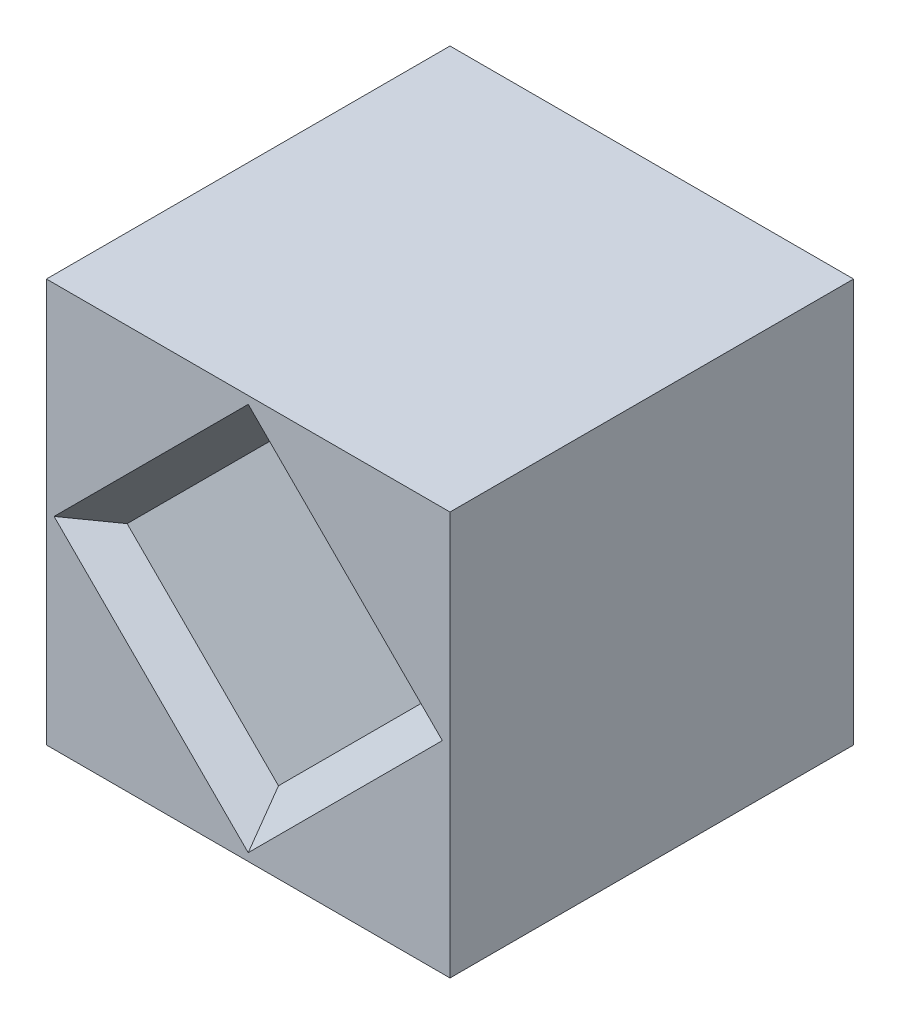
ISO-10303-21;
HEADER;
FILE_DESCRIPTION(('STEP AP214'),'2;1');
FILE_NAME('part.step','',(''),(''),'','','');
FILE_SCHEMA(('AUTOMOTIVE_DESIGN { 1 0 10303 214 1 1 1 1 }'));
ENDSEC;
DATA;
#1=APPLICATION_CONTEXT('core data for automotive mechanical design processes');
#2=APPLICATION_PROTOCOL_DEFINITION('international standard','automotive_design',2000,#1);
#3=PRODUCT_CONTEXT('',#1,'mechanical');
#4=PRODUCT('Part','Part','',(#3));
#5=PRODUCT_RELATED_PRODUCT_CATEGORY('part','',(#4));
#6=PRODUCT_DEFINITION_FORMATION('','',#4);
#7=PRODUCT_DEFINITION_CONTEXT('part definition',#1,'design');
#8=PRODUCT_DEFINITION('design','',#6,#7);
#9=PRODUCT_DEFINITION_SHAPE('','',#8);
#10=(LENGTH_UNIT() NAMED_UNIT(*) SI_UNIT(.MILLI.,.METRE.));
#11=(NAMED_UNIT(*) PLANE_ANGLE_UNIT() SI_UNIT($,.RADIAN.));
#12=(NAMED_UNIT(*) SI_UNIT($,.STERADIAN.) SOLID_ANGLE_UNIT());
#13=UNCERTAINTY_MEASURE_WITH_UNIT(LENGTH_MEASURE(1.E-05),#10,'distance_accuracy_value','');
#14=(GEOMETRIC_REPRESENTATION_CONTEXT(3) GLOBAL_UNCERTAINTY_ASSIGNED_CONTEXT((#13)) GLOBAL_UNIT_ASSIGNED_CONTEXT((#10,
#11,#12)) REPRESENTATION_CONTEXT('',''));
#15=CARTESIAN_POINT('',(0.,0.,0.));
#16=DIRECTION('',(0.,0.,1.));
#17=DIRECTION('',(1.,0.,0.));
#18=AXIS2_PLACEMENT_3D('',#15,#16,#17);
#19=CARTESIAN_POINT('',(0.,8.46666666666667,0.));
#20=DIRECTION('',(1.,0.,0.));
#21=DIRECTION('',(0.,0.,-1.));
#22=AXIS2_PLACEMENT_3D('',#19,#20,#21);
#23=PLANE('',#22);
#24=DIRECTION('',(0.,0.,1.));
#25=VECTOR('',#24,1.);
#26=CARTESIAN_POINT('',(0.,0.,0.));
#27=LINE('',#26,#25);
#28=CARTESIAN_POINT('',(0.,0.,-8.46666666666667));
#29=VERTEX_POINT('',#28);
#30=CARTESIAN_POINT('',(0.,0.,0.));
#31=VERTEX_POINT('',#30);
#32=EDGE_CURVE('E165',#29,#31,#27,.T.);
#33=ORIENTED_EDGE('',*,*,#32,.T.);
#34=DIRECTION('',(0.,-1.,0.));
#35=VECTOR('',#34,1.);
#36=CARTESIAN_POINT('',(0.,8.46666666666667,0.));
#37=LINE('',#36,#35);
#38=CARTESIAN_POINT('',(0.,8.46666666666667,0.));
#39=VERTEX_POINT('',#38);
#40=EDGE_CURVE('E144',#39,#31,#37,.T.);
#41=ORIENTED_EDGE('',*,*,#40,.F.);
#42=DIRECTION('',(0.,0.,1.));
#43=VECTOR('',#42,1.);
#44=CARTESIAN_POINT('',(0.,8.46666666666667,0.));
#45=LINE('',#44,#43);
#46=CARTESIAN_POINT('',(0.,8.46666666666667,-8.46666666666667));
#47=VERTEX_POINT('',#46);
#48=EDGE_CURVE('E152',#47,#39,#45,.T.);
#49=ORIENTED_EDGE('',*,*,#48,.F.);
#50=DIRECTION('',(0.,-1.,0.));
#51=VECTOR('',#50,1.);
#52=CARTESIAN_POINT('',(0.,8.46666666666667,-8.46666666666667));
#53=LINE('',#52,#51);
#54=EDGE_CURVE('E288',#47,#29,#53,.T.);
#55=ORIENTED_EDGE('',*,*,#54,.T.);
#56=EDGE_LOOP('',(#33,#41,#49,#55));
#57=FACE_BOUND('',#56,.T.);
#58=ADVANCED_FACE('F47',(#57),#23,.F.);
#59=CARTESIAN_POINT('',(0.,8.46666666666667,0.));
#60=DIRECTION('',(0.,0.,-1.));
#61=DIRECTION('',(-1.,0.,0.));
#62=AXIS2_PLACEMENT_3D('',#59,#60,#61);
#63=PLANE('',#62);
#64=DIRECTION('',(0.707106781186548,0.707106781186547,0.));
#65=VECTOR('',#64,1.);
#66=CARTESIAN_POINT('',(2.19682052727987,6.26984613938679,0.));
#67=LINE('',#66,#65);
#68=CARTESIAN_POINT('',(0.160307721226414,4.23333333333333,0.));
#69=VERTEX_POINT('',#68);
#70=CARTESIAN_POINT('',(4.23333333333333,8.30635894544025,0.));
#71=VERTEX_POINT('',#70);
#72=EDGE_CURVE('E212',#69,#71,#67,.T.);
#73=ORIENTED_EDGE('',*,*,#72,.T.);
#74=DIRECTION('',(0.707106781186548,-0.707106781186548,0.));
#75=VECTOR('',#74,1.);
#76=CARTESIAN_POINT('',(2.03651280605346,10.5031794727201,0.));
#77=LINE('',#76,#75);
#78=CARTESIAN_POINT('',(8.30635894544025,4.23333333333334,0.));
#79=VERTEX_POINT('',#78);
#80=EDGE_CURVE('E11',#71,#79,#77,.T.);
#81=ORIENTED_EDGE('',*,*,#80,.T.);
#82=DIRECTION('',(-0.707106781186547,-0.707106781186548,0.));
#83=VECTOR('',#82,1.);
#84=CARTESIAN_POINT('',(6.26984613938679,2.19682052727988,0.));
#85=LINE('',#84,#83);
#86=CARTESIAN_POINT('',(4.23333333333333,0.160307721226415,0.));
#87=VERTEX_POINT('',#86);
#88=EDGE_CURVE('E58',#79,#87,#85,.T.);
#89=ORIENTED_EDGE('',*,*,#88,.T.);
#90=DIRECTION('',(-0.707106781186548,0.707106781186547,0.));
#91=VECTOR('',#90,1.);
#92=CARTESIAN_POINT('',(-2.03651280605346,6.43015386061321,0.));
#93=LINE('',#92,#91);
#94=EDGE_CURVE('E215',#87,#69,#93,.T.);
#95=ORIENTED_EDGE('',*,*,#94,.T.);
#96=EDGE_LOOP('',(#73,#81,#89,#95));
#97=FACE_BOUND('',#96,.T.);
#98=DIRECTION('',(1.,0.,0.));
#99=VECTOR('',#98,1.);
#100=CARTESIAN_POINT('',(0.,0.,0.));
#101=LINE('',#100,#99);
#102=CARTESIAN_POINT('',(8.46666666666667,0.,0.));
#103=VERTEX_POINT('',#102);
#104=EDGE_CURVE('E275',#31,#103,#101,.T.);
#105=ORIENTED_EDGE('',*,*,#104,.T.);
#106=DIRECTION('',(0.,-1.,0.));
#107=VECTOR('',#106,1.);
#108=CARTESIAN_POINT('',(8.46666666666667,8.46666666666667,0.));
#109=LINE('',#108,#107);
#110=CARTESIAN_POINT('',(8.46666666666667,8.46666666666667,0.));
#111=VERTEX_POINT('',#110);
#112=EDGE_CURVE('E147',#111,#103,#109,.T.);
#113=ORIENTED_EDGE('',*,*,#112,.F.);
#114=DIRECTION('',(1.,0.,0.));
#115=VECTOR('',#114,1.);
#116=CARTESIAN_POINT('',(0.,8.46666666666667,0.));
#117=LINE('',#116,#115);
#118=EDGE_CURVE('E140',#39,#111,#117,.T.);
#119=ORIENTED_EDGE('',*,*,#118,.F.);
#120=ORIENTED_EDGE('',*,*,#40,.T.);
#121=EDGE_LOOP('',(#105,#113,#119,#120));
#122=FACE_BOUND('',#121,.T.);
#123=ADVANCED_FACE('F142',(#97,#122),#63,.F.);
#124=CARTESIAN_POINT('',(8.46666666666667,8.46666666666667,0.));
#125=DIRECTION('',(-1.,0.,0.));
#126=DIRECTION('',(0.,0.,1.));
#127=AXIS2_PLACEMENT_3D('',#124,#125,#126);
#128=PLANE('',#127);
#129=DIRECTION('',(0.,0.,-1.));
#130=VECTOR('',#129,1.);
#131=CARTESIAN_POINT('',(8.46666666666667,0.,0.));
#132=LINE('',#131,#130);
#133=CARTESIAN_POINT('',(8.46666666666667,0.,-8.46666666666667));
#134=VERTEX_POINT('',#133);
#135=EDGE_CURVE('E292',#103,#134,#132,.T.);
#136=ORIENTED_EDGE('',*,*,#135,.T.);
#137=DIRECTION('',(0.,-1.,0.));
#138=VECTOR('',#137,1.);
#139=CARTESIAN_POINT('',(8.46666666666667,8.46666666666667,-8.46666666666667));
#140=LINE('',#139,#138);
#141=CARTESIAN_POINT('',(8.46666666666667,8.46666666666667,-8.46666666666667));
#142=VERTEX_POINT('',#141);
#143=EDGE_CURVE('E173',#142,#134,#140,.T.);
#144=ORIENTED_EDGE('',*,*,#143,.F.);
#145=DIRECTION('',(0.,0.,-1.));
#146=VECTOR('',#145,1.);
#147=CARTESIAN_POINT('',(8.46666666666667,8.46666666666667,0.));
#148=LINE('',#147,#146);
#149=EDGE_CURVE('E151',#111,#142,#148,.T.);
#150=ORIENTED_EDGE('',*,*,#149,.F.);
#151=ORIENTED_EDGE('',*,*,#112,.T.);
#152=EDGE_LOOP('',(#136,#144,#150,#151));
#153=FACE_BOUND('',#152,.T.);
#154=ADVANCED_FACE('F308',(#153),#128,.F.);
#155=CARTESIAN_POINT('',(0.,8.46666666666667,-8.46666666666667));
#156=DIRECTION('',(0.,0.,1.));
#157=DIRECTION('',(1.,0.,0.));
#158=AXIS2_PLACEMENT_3D('',#155,#156,#157);
#159=PLANE('',#158);
#160=DIRECTION('',(-1.,0.,0.));
#161=VECTOR('',#160,1.);
#162=CARTESIAN_POINT('',(0.,0.,-8.46666666666667));
#163=LINE('',#162,#161);
#164=EDGE_CURVE('E162',#134,#29,#163,.T.);
#165=ORIENTED_EDGE('',*,*,#164,.T.);
#166=ORIENTED_EDGE('',*,*,#54,.F.);
#167=DIRECTION('',(-1.,0.,0.));
#168=VECTOR('',#167,1.);
#169=CARTESIAN_POINT('',(0.,8.46666666666667,-8.46666666666667));
#170=LINE('',#169,#168);
#171=EDGE_CURVE('E157',#142,#47,#170,.T.);
#172=ORIENTED_EDGE('',*,*,#171,.F.);
#173=ORIENTED_EDGE('',*,*,#143,.T.);
#174=EDGE_LOOP('',(#165,#166,#172,#173));
#175=FACE_BOUND('',#174,.T.);
#176=ADVANCED_FACE('F303',(#175),#159,.F.);
#177=CARTESIAN_POINT('',(0.,8.46666666666667,0.));
#178=DIRECTION('',(0.,-1.,0.));
#179=DIRECTION('',(0.,0.,-1.));
#180=AXIS2_PLACEMENT_3D('',#177,#178,#179);
#181=PLANE('',#180);
#182=ORIENTED_EDGE('',*,*,#48,.T.);
#183=ORIENTED_EDGE('',*,*,#118,.T.);
#184=ORIENTED_EDGE('',*,*,#149,.T.);
#185=ORIENTED_EDGE('',*,*,#171,.T.);
#186=EDGE_LOOP('',(#182,#183,#184,#185));
#187=FACE_BOUND('',#186,.T.);
#188=ADVANCED_FACE('F155',(#187),#181,.F.);
#189=CARTESIAN_POINT('',(0.,0.,0.));
#190=DIRECTION('',(0.,-1.,0.));
#191=DIRECTION('',(0.,0.,-1.));
#192=AXIS2_PLACEMENT_3D('',#189,#190,#191);
#193=PLANE('',#192);
#194=ORIENTED_EDGE('',*,*,#32,.F.);
#195=ORIENTED_EDGE('',*,*,#164,.F.);
#196=ORIENTED_EDGE('',*,*,#135,.F.);
#197=ORIENTED_EDGE('',*,*,#104,.F.);
#198=EDGE_LOOP('',(#194,#195,#196,#197));
#199=FACE_BOUND('',#198,.T.);
#200=ADVANCED_FACE('F307',(#199),#193,.T.);
#201=CARTESIAN_POINT('',(1.05833333333333,4.23333333333333,-6.35));
#202=DIRECTION('',(-0.707106781186547,0.707106781186548,0.));
#203=DIRECTION('',(-0.707106781186548,-0.707106781186547,0.));
#204=AXIS2_PLACEMENT_3D('',#201,#202,#203);
#205=PLANE('',#204);
#206=DIRECTION('',(0.,0.,1.));
#207=VECTOR('',#206,1.);
#208=CARTESIAN_POINT('',(1.05833333333333,4.23333333333333,-6.35));
#209=LINE('',#208,#207);
#210=CARTESIAN_POINT('',(1.05833333333333,4.23333333333333,-5.715));
#211=VERTEX_POINT('',#210);
#212=CARTESIAN_POINT('',(1.05833333333333,4.23333333333333,-0.634999999999998));
#213=VERTEX_POINT('',#212);
#214=EDGE_CURVE('E234',#211,#213,#209,.T.);
#215=ORIENTED_EDGE('',*,*,#214,.F.);
#216=DIRECTION('',(0.707106781186548,0.707106781186547,0.));
#217=VECTOR('',#216,1.);
#218=CARTESIAN_POINT('',(4.23333333333333,7.40833333333333,-5.715));
#219=LINE('',#218,#217);
#220=CARTESIAN_POINT('',(4.23333333333333,7.40833333333333,-5.715));
#221=VERTEX_POINT('',#220);
#222=EDGE_CURVE('E209',#211,#221,#219,.T.);
#223=ORIENTED_EDGE('',*,*,#222,.T.);
#224=DIRECTION('',(0.,0.,1.));
#225=VECTOR('',#224,1.);
#226=CARTESIAN_POINT('',(4.23333333333333,7.40833333333333,-6.35));
#227=LINE('',#226,#225);
#228=CARTESIAN_POINT('',(4.23333333333333,7.40833333333333,-0.634999999999998));
#229=VERTEX_POINT('',#228);
#230=EDGE_CURVE('E265',#221,#229,#227,.T.);
#231=ORIENTED_EDGE('',*,*,#230,.T.);
#232=DIRECTION('',(-0.707106781186548,-0.707106781186547,0.));
#233=VECTOR('',#232,1.);
#234=CARTESIAN_POINT('',(1.05833333333333,4.23333333333333,-0.634999999999998));
#235=LINE('',#234,#233);
#236=EDGE_CURVE('E206',#229,#213,#235,.T.);
#237=ORIENTED_EDGE('',*,*,#236,.T.);
#238=EDGE_LOOP('',(#215,#223,#231,#237));
#239=FACE_BOUND('',#238,.T.);
#240=ADVANCED_FACE('F269',(#239),#205,.F.);
#241=CARTESIAN_POINT('',(4.23333333333333,7.40833333333333,-6.35));
#242=DIRECTION('',(0.707106781186548,0.707106781186548,0.));
#243=DIRECTION('',(-0.707106781186548,0.707106781186548,0.));
#244=AXIS2_PLACEMENT_3D('',#241,#242,#243);
#245=PLANE('',#244);
#246=ORIENTED_EDGE('',*,*,#230,.F.);
#247=DIRECTION('',(0.707106781186548,-0.707106781186548,0.));
#248=VECTOR('',#247,1.);
#249=CARTESIAN_POINT('',(7.40833333333333,4.23333333333333,-5.715));
#250=LINE('',#249,#248);
#251=CARTESIAN_POINT('',(7.40833333333333,4.23333333333333,-5.715));
#252=VERTEX_POINT('',#251);
#253=EDGE_CURVE('E190',#221,#252,#250,.T.);
#254=ORIENTED_EDGE('',*,*,#253,.T.);
#255=DIRECTION('',(0.,0.,1.));
#256=VECTOR('',#255,1.);
#257=CARTESIAN_POINT('',(7.40833333333333,4.23333333333333,-6.35));
#258=LINE('',#257,#256);
#259=CARTESIAN_POINT('',(7.40833333333333,4.23333333333333,-0.634999999999998));
#260=VERTEX_POINT('',#259);
#261=EDGE_CURVE('E268',#252,#260,#258,.T.);
#262=ORIENTED_EDGE('',*,*,#261,.T.);
#263=DIRECTION('',(-0.707106781186548,0.707106781186548,0.));
#264=VECTOR('',#263,1.);
#265=CARTESIAN_POINT('',(4.23333333333333,7.40833333333333,-0.634999999999998));
#266=LINE('',#265,#264);
#267=EDGE_CURVE('E186',#260,#229,#266,.T.);
#268=ORIENTED_EDGE('',*,*,#267,.T.);
#269=EDGE_LOOP('',(#246,#254,#262,#268));
#270=FACE_BOUND('',#269,.T.);
#271=ADVANCED_FACE('F264',(#270),#245,.F.);
#272=CARTESIAN_POINT('',(4.23333333333333,1.05833333333333,-6.35));
#273=DIRECTION('',(0.707106781186548,-0.707106781186547,0.));
#274=DIRECTION('',(0.707106781186547,0.707106781186548,0.));
#275=AXIS2_PLACEMENT_3D('',#272,#273,#274);
#276=PLANE('',#275);
#277=ORIENTED_EDGE('',*,*,#261,.F.);
#278=DIRECTION('',(-0.707106781186547,-0.707106781186548,0.));
#279=VECTOR('',#278,1.);
#280=CARTESIAN_POINT('',(4.23333333333333,1.05833333333333,-5.715));
#281=LINE('',#280,#279);
#282=CARTESIAN_POINT('',(4.23333333333333,1.05833333333333,-5.715));
#283=VERTEX_POINT('',#282);
#284=EDGE_CURVE('E197',#252,#283,#281,.T.);
#285=ORIENTED_EDGE('',*,*,#284,.T.);
#286=DIRECTION('',(0.,0.,1.));
#287=VECTOR('',#286,1.);
#288=CARTESIAN_POINT('',(4.23333333333333,1.05833333333333,-6.35));
#289=LINE('',#288,#287);
#290=CARTESIAN_POINT('',(4.23333333333333,1.05833333333333,-0.634999999999998));
#291=VERTEX_POINT('',#290);
#292=EDGE_CURVE('E277',#283,#291,#289,.T.);
#293=ORIENTED_EDGE('',*,*,#292,.T.);
#294=DIRECTION('',(0.707106781186547,0.707106781186548,0.));
#295=VECTOR('',#294,1.);
#296=CARTESIAN_POINT('',(4.23333333333333,1.05833333333333,-0.634999999999998));
#297=LINE('',#296,#295);
#298=EDGE_CURVE('E194',#291,#260,#297,.T.);
#299=ORIENTED_EDGE('',*,*,#298,.T.);
#300=EDGE_LOOP('',(#277,#285,#293,#299));
#301=FACE_BOUND('',#300,.T.);
#302=ADVANCED_FACE('F405',(#301),#276,.F.);
#303=CARTESIAN_POINT('',(1.05833333333333,4.23333333333333,-6.35));
#304=DIRECTION('',(-0.707106781186547,-0.707106781186548,0.));
#305=DIRECTION('',(0.707106781186548,-0.707106781186547,0.));
#306=AXIS2_PLACEMENT_3D('',#303,#304,#305);
#307=PLANE('',#306);
#308=ORIENTED_EDGE('',*,*,#292,.F.);
#309=DIRECTION('',(-0.707106781186548,0.707106781186547,0.));
#310=VECTOR('',#309,1.);
#311=CARTESIAN_POINT('',(1.05833333333333,4.23333333333333,-5.715));
#312=LINE('',#311,#310);
#313=EDGE_CURVE('E203',#283,#211,#312,.T.);
#314=ORIENTED_EDGE('',*,*,#313,.T.);
#315=ORIENTED_EDGE('',*,*,#214,.T.);
#316=DIRECTION('',(0.707106781186548,-0.707106781186547,0.));
#317=VECTOR('',#316,1.);
#318=CARTESIAN_POINT('',(1.05833333333333,4.23333333333333,-0.634999999999998));
#319=LINE('',#318,#317);
#320=EDGE_CURVE('E200',#213,#291,#319,.T.);
#321=ORIENTED_EDGE('',*,*,#320,.T.);
#322=EDGE_LOOP('',(#308,#314,#315,#321));
#323=FACE_BOUND('',#322,.T.);
#324=ADVANCED_FACE('F396',(#323),#307,.F.);
#325=CARTESIAN_POINT('',(0.,0.,-6.35));
#326=DIRECTION('',(0.,0.,-1.));
#327=DIRECTION('',(-1.,0.,0.));
#328=AXIS2_PLACEMENT_3D('',#325,#326,#327);
#329=PLANE('',#328);
#330=DIRECTION('',(0.707106781186547,0.707106781186548,0.));
#331=VECTOR('',#330,1.);
#332=CARTESIAN_POINT('',(6.95932052727987,4.68234613938679,-6.35));
#333=LINE('',#332,#331);
#334=CARTESIAN_POINT('',(4.23333333333333,1.95635894544025,-6.35));
#335=VERTEX_POINT('',#334);
#336=CARTESIAN_POINT('',(6.51030772122641,4.23333333333333,-6.35));
#337=VERTEX_POINT('',#336);
#338=EDGE_CURVE('E179',#335,#337,#333,.T.);
#339=ORIENTED_EDGE('',*,*,#338,.T.);
#340=DIRECTION('',(-0.707106781186548,0.707106781186548,0.));
#341=VECTOR('',#340,1.);
#342=CARTESIAN_POINT('',(3.78432052727987,6.95932052727987,-6.35));
#343=LINE('',#342,#341);
#344=CARTESIAN_POINT('',(4.23333333333333,6.51030772122641,-6.35));
#345=VERTEX_POINT('',#344);
#346=EDGE_CURVE('E182',#337,#345,#343,.T.);
#347=ORIENTED_EDGE('',*,*,#346,.T.);
#348=DIRECTION('',(-0.707106781186548,-0.707106781186547,0.));
#349=VECTOR('',#348,1.);
#350=CARTESIAN_POINT('',(1.50734613938679,3.78432052727987,-6.35));
#351=LINE('',#350,#349);
#352=CARTESIAN_POINT('',(1.95635894544025,4.23333333333333,-6.35));
#353=VERTEX_POINT('',#352);
#354=EDGE_CURVE('E167',#345,#353,#351,.T.);
#355=ORIENTED_EDGE('',*,*,#354,.T.);
#356=DIRECTION('',(0.707106781186548,-0.707106781186547,0.));
#357=VECTOR('',#356,1.);
#358=CARTESIAN_POINT('',(4.68234613938679,1.50734613938679,-6.35));
#359=LINE('',#358,#357);
#360=EDGE_CURVE('E171',#353,#335,#359,.T.);
#361=ORIENTED_EDGE('',*,*,#360,.T.);
#362=EDGE_LOOP('',(#339,#347,#355,#361));
#363=FACE_BOUND('',#362,.T.);
#364=ADVANCED_FACE('F349',(#363),#329,.F.);
#365=CARTESIAN_POINT('',(3.09484613938679,3.09484613938679,-6.35));
#366=DIRECTION('',(0.499999999999997,0.499999999999997,0.707106781186552));
#367=DIRECTION('',(-0.707106781186548,0.707106781186547,0.));
#368=AXIS2_PLACEMENT_3D('',#365,#366,#367);
#369=PLANE('',#368);
#370=DIRECTION('',(0.816496580927729,0.,-0.577350269189621));
#371=VECTOR('',#370,1.);
#372=CARTESIAN_POINT('',(2.71535040807129,4.23333333333333,-6.88668801008909));
#373=LINE('',#372,#371);
#374=EDGE_CURVE('E226',#211,#353,#373,.T.);
#375=ORIENTED_EDGE('',*,*,#374,.F.);
#376=ORIENTED_EDGE('',*,*,#313,.F.);
#377=DIRECTION('',(0.,0.816496580927729,-0.577350269189621));
#378=VECTOR('',#377,1.);
#379=CARTESIAN_POINT('',(4.23333333333333,-0.106871814150958,-4.8910755387404));
#380=LINE('',#379,#378);
#381=EDGE_CURVE('E230',#335,#283,#380,.F.);
#382=ORIENTED_EDGE('',*,*,#381,.F.);
#383=ORIENTED_EDGE('',*,*,#360,.F.);
#384=EDGE_LOOP('',(#375,#376,#382,#383));
#385=FACE_BOUND('',#384,.T.);
#386=ADVANCED_FACE('F343',(#385),#369,.T.);
#387=CARTESIAN_POINT('',(1.13848719394654,-1.13848719394654,-6.35));
#388=DIRECTION('',(-0.499999999999997,0.499999999999997,0.707106781186552));
#389=DIRECTION('',(-0.707106781186547,-0.707106781186548,0.));
#390=AXIS2_PLACEMENT_3D('',#387,#388,#389);
#391=PLANE('',#390);
#392=ORIENTED_EDGE('',*,*,#381,.T.);
#393=ORIENTED_EDGE('',*,*,#284,.F.);
#394=DIRECTION('',(-0.81649658092773,0.,-0.577350269189621));
#395=VECTOR('',#394,1.);
#396=CARTESIAN_POINT('',(5.75131625859538,4.23333333333333,-6.88668801008909));
#397=LINE('',#396,#395);
#398=EDGE_CURVE('E223',#337,#252,#397,.F.);
#399=ORIENTED_EDGE('',*,*,#398,.F.);
#400=ORIENTED_EDGE('',*,*,#338,.F.);
#401=EDGE_LOOP('',(#392,#393,#399,#400));
#402=FACE_BOUND('',#401,.T.);
#403=ADVANCED_FACE('F336',(#402),#391,.T.);
#404=CARTESIAN_POINT('',(-1.13848719394654,1.13848719394654,-6.35));
#405=DIRECTION('',(0.499999999999997,-0.499999999999997,0.707106781186552));
#406=DIRECTION('',(0.707106781186548,0.707106781186547,0.));
#407=AXIS2_PLACEMENT_3D('',#404,#405,#406);
#408=PLANE('',#407);
#409=ORIENTED_EDGE('',*,*,#374,.T.);
#410=ORIENTED_EDGE('',*,*,#354,.F.);
#411=DIRECTION('',(0.,0.81649658092773,0.57735026918962));
#412=VECTOR('',#411,1.);
#413=CARTESIAN_POINT('',(4.23333333333333,5.75131625859538,-6.88668801008909));
#414=LINE('',#413,#412);
#415=EDGE_CURVE('E220',#221,#345,#414,.F.);
#416=ORIENTED_EDGE('',*,*,#415,.F.);
#417=ORIENTED_EDGE('',*,*,#222,.F.);
#418=EDGE_LOOP('',(#409,#410,#416,#417));
#419=FACE_BOUND('',#418,.T.);
#420=ADVANCED_FACE('F329',(#419),#408,.T.);
#421=CARTESIAN_POINT('',(5.37182052727987,5.37182052727987,-6.35));
#422=DIRECTION('',(-0.499999999999996,-0.499999999999996,0.707106781186553));
#423=DIRECTION('',(0.707106781186548,-0.707106781186548,0.));
#424=AXIS2_PLACEMENT_3D('',#421,#422,#423);
#425=PLANE('',#424);
#426=ORIENTED_EDGE('',*,*,#398,.T.);
#427=ORIENTED_EDGE('',*,*,#253,.F.);
#428=ORIENTED_EDGE('',*,*,#415,.T.);
#429=ORIENTED_EDGE('',*,*,#346,.F.);
#430=EDGE_LOOP('',(#426,#427,#428,#429));
#431=FACE_BOUND('',#430,.T.);
#432=ADVANCED_FACE('F323',(#431),#425,.T.);
#433=CARTESIAN_POINT('',(1.05833333333333,4.23333333333333,-0.634999999999998));
#434=DIRECTION('',(-0.499999999999999,-0.499999999999999,-0.707106781186549));
#435=DIRECTION('',(0.707106781186548,-0.707106781186547,0.));
#436=AXIS2_PLACEMENT_3D('',#433,#434,#435);
#437=PLANE('',#436);
#438=DIRECTION('',(0.816496580927727,0.,-0.577350269189624));
#439=VECTOR('',#438,1.);
#440=CARTESIAN_POINT('',(1.05833333333333,4.23333333333333,-0.634999999999998));
#441=LINE('',#440,#439);
#442=EDGE_CURVE('E239',#69,#213,#441,.T.);
#443=ORIENTED_EDGE('',*,*,#442,.F.);
#444=ORIENTED_EDGE('',*,*,#94,.F.);
#445=DIRECTION('',(0.,0.816496580927727,-0.577350269189624));
#446=VECTOR('',#445,1.);
#447=CARTESIAN_POINT('',(4.23333333333333,1.05833333333333,-0.634999999999998));
#448=LINE('',#447,#446);
#449=EDGE_CURVE('E52',#291,#87,#448,.F.);
#450=ORIENTED_EDGE('',*,*,#449,.F.);
#451=ORIENTED_EDGE('',*,*,#320,.F.);
#452=EDGE_LOOP('',(#443,#444,#450,#451));
#453=FACE_BOUND('',#452,.T.);
#454=ADVANCED_FACE('F50',(#453),#437,.F.);
#455=CARTESIAN_POINT('',(4.23333333333333,1.05833333333333,-0.634999999999998));
#456=DIRECTION('',(0.499999999999999,-0.499999999999999,-0.707106781186549));
#457=DIRECTION('',(0.707106781186547,0.707106781186548,0.));
#458=AXIS2_PLACEMENT_3D('',#455,#456,#457);
#459=PLANE('',#458);
#460=ORIENTED_EDGE('',*,*,#449,.T.);
#461=ORIENTED_EDGE('',*,*,#88,.F.);
#462=DIRECTION('',(-0.816496580927727,0.,-0.577350269189624));
#463=VECTOR('',#462,1.);
#464=CARTESIAN_POINT('',(5.29166666666666,4.23333333333333,-2.13170935351152));
#465=LINE('',#464,#463);
#466=EDGE_CURVE('E66',#260,#79,#465,.F.);
#467=ORIENTED_EDGE('',*,*,#466,.F.);
#468=ORIENTED_EDGE('',*,*,#298,.F.);
#469=EDGE_LOOP('',(#460,#461,#467,#468));
#470=FACE_BOUND('',#469,.T.);
#471=ADVANCED_FACE('F251',(#470),#459,.F.);
#472=CARTESIAN_POINT('',(1.05833333333333,4.23333333333333,-0.634999999999998));
#473=DIRECTION('',(-0.499999999999999,0.499999999999999,-0.707106781186549));
#474=DIRECTION('',(-0.707106781186548,-0.707106781186547,0.));
#475=AXIS2_PLACEMENT_3D('',#472,#473,#474);
#476=PLANE('',#475);
#477=ORIENTED_EDGE('',*,*,#442,.T.);
#478=ORIENTED_EDGE('',*,*,#236,.F.);
#479=DIRECTION('',(0.,0.816496580927728,0.577350269189624));
#480=VECTOR('',#479,1.);
#481=CARTESIAN_POINT('',(4.23333333333333,7.40833333333333,-0.634999999999998));
#482=LINE('',#481,#480);
#483=EDGE_CURVE('E235',#71,#229,#482,.F.);
#484=ORIENTED_EDGE('',*,*,#483,.F.);
#485=ORIENTED_EDGE('',*,*,#72,.F.);
#486=EDGE_LOOP('',(#477,#478,#484,#485));
#487=FACE_BOUND('',#486,.T.);
#488=ADVANCED_FACE('F256',(#487),#476,.F.);
#489=CARTESIAN_POINT('',(4.23333333333333,7.40833333333333,-0.634999999999998));
#490=DIRECTION('',(0.499999999999998,0.499999999999998,-0.70710678118655));
#491=DIRECTION('',(-0.707106781186548,0.707106781186548,0.));
#492=AXIS2_PLACEMENT_3D('',#489,#490,#491);
#493=PLANE('',#492);
#494=ORIENTED_EDGE('',*,*,#466,.T.);
#495=ORIENTED_EDGE('',*,*,#80,.F.);
#496=ORIENTED_EDGE('',*,*,#483,.T.);
#497=ORIENTED_EDGE('',*,*,#267,.F.);
#498=EDGE_LOOP('',(#494,#495,#496,#497));
#499=FACE_BOUND('',#498,.T.);
#500=ADVANCED_FACE('F255',(#499),#493,.F.);
#501=CLOSED_SHELL('',(#58,#123,#154,#176,#188,#200,#240,#271,#302,#324,#364,#386,#403,#420,#432,
#454,#471,#488,#500));
#502=MANIFOLD_SOLID_BREP('B2',#501);
#503=ADVANCED_BREP_SHAPE_REPRESENTATION('',(#18,#502),#14);
#504=SHAPE_DEFINITION_REPRESENTATION(#9,#503);
ENDSEC;
END-ISO-10303-21;
